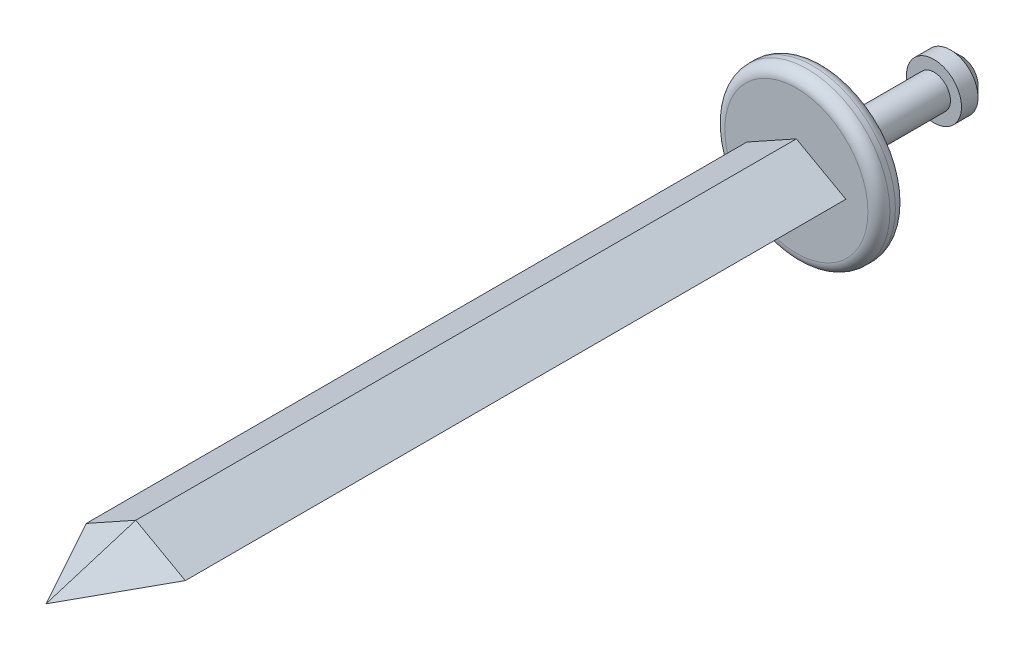
ISO-10303-21;
HEADER;
FILE_DESCRIPTION(('STEP AP214'),'2;1');
FILE_NAME('part.step','',(''),(''),'','','');
FILE_SCHEMA(('AUTOMOTIVE_DESIGN { 1 0 10303 214 1 1 1 1 }'));
ENDSEC;
DATA;
#1=APPLICATION_CONTEXT('core data for automotive mechanical design processes');
#2=APPLICATION_PROTOCOL_DEFINITION('international standard','automotive_design',2000,#1);
#3=PRODUCT_CONTEXT('',#1,'mechanical');
#4=PRODUCT('Part','Part','',(#3));
#5=PRODUCT_RELATED_PRODUCT_CATEGORY('part','',(#4));
#6=PRODUCT_DEFINITION_FORMATION('','',#4);
#7=PRODUCT_DEFINITION_CONTEXT('part definition',#1,'design');
#8=PRODUCT_DEFINITION('design','',#6,#7);
#9=PRODUCT_DEFINITION_SHAPE('','',#8);
#10=(LENGTH_UNIT() NAMED_UNIT(*) SI_UNIT(.MILLI.,.METRE.));
#11=(NAMED_UNIT(*) PLANE_ANGLE_UNIT() SI_UNIT($,.RADIAN.));
#12=(NAMED_UNIT(*) SI_UNIT($,.STERADIAN.) SOLID_ANGLE_UNIT());
#13=UNCERTAINTY_MEASURE_WITH_UNIT(LENGTH_MEASURE(1.E-05),#10,'distance_accuracy_value','');
#14=(GEOMETRIC_REPRESENTATION_CONTEXT(3) GLOBAL_UNCERTAINTY_ASSIGNED_CONTEXT((#13)) GLOBAL_UNIT_ASSIGNED_CONTEXT((#10,
#11,#12)) REPRESENTATION_CONTEXT('',''));
#15=CARTESIAN_POINT('',(0.,0.,0.));
#16=DIRECTION('',(0.,0.,1.));
#17=DIRECTION('',(1.,0.,0.));
#18=AXIS2_PLACEMENT_3D('',#15,#16,#17);
#19=CARTESIAN_POINT('',(0.,0.,5.));
#20=DIRECTION('',(0.,0.,1.));
#21=DIRECTION('',(1.,0.,0.));
#22=AXIS2_PLACEMENT_3D('',#19,#20,#21);
#23=PLANE('',#22);
#24=CARTESIAN_POINT('',(0.,0.,5.));
#25=DIRECTION('',(0.,0.,1.));
#26=DIRECTION('',(1.,0.,0.));
#27=AXIS2_PLACEMENT_3D('',#24,#25,#26);
#28=CIRCLE('',#27,13.);
#29=CARTESIAN_POINT('',(13.,0.,5.));
#30=VERTEX_POINT('',#29);
#31=EDGE_CURVE('E169',#30,#30,#28,.T.);
#32=ORIENTED_EDGE('',*,*,#31,.T.);
#33=EDGE_LOOP('',(#32));
#34=FACE_BOUND('',#33,.T.);
#35=DIRECTION('',(0.874157276121538,-0.485642931178632,0.));
#36=VECTOR('',#35,1.);
#37=CARTESIAN_POINT('',(-9.,0.,5.));
#38=LINE('',#37,#36);
#39=CARTESIAN_POINT('',(-9.,0.,5.));
#40=VERTEX_POINT('',#39);
#41=CARTESIAN_POINT('',(0.,-5.,5.));
#42=VERTEX_POINT('',#41);
#43=EDGE_CURVE('E128',#40,#42,#38,.T.);
#44=ORIENTED_EDGE('',*,*,#43,.F.);
#45=DIRECTION('',(-0.874157276121538,-0.485642931178632,0.));
#46=VECTOR('',#45,1.);
#47=CARTESIAN_POINT('',(-9.,0.,5.));
#48=LINE('',#47,#46);
#49=CARTESIAN_POINT('',(0.,5.,5.));
#50=VERTEX_POINT('',#49);
#51=EDGE_CURVE('E125',#50,#40,#48,.T.);
#52=ORIENTED_EDGE('',*,*,#51,.F.);
#53=DIRECTION('',(-0.874157276121538,0.485642931178632,0.));
#54=VECTOR('',#53,1.);
#55=CARTESIAN_POINT('',(0.,5.,5.));
#56=LINE('',#55,#54);
#57=CARTESIAN_POINT('',(9.,0.,5.));
#58=VERTEX_POINT('',#57);
#59=EDGE_CURVE('E75',#58,#50,#56,.T.);
#60=ORIENTED_EDGE('',*,*,#59,.F.);
#61=DIRECTION('',(0.874157276121538,0.485642931178632,0.));
#62=VECTOR('',#61,1.);
#63=CARTESIAN_POINT('',(0.,-5.,5.));
#64=LINE('',#63,#62);
#65=EDGE_CURVE('E132',#42,#58,#64,.T.);
#66=ORIENTED_EDGE('',*,*,#65,.F.);
#67=EDGE_LOOP('',(#44,#52,#60,#66));
#68=FACE_BOUND('',#67,.T.);
#69=ADVANCED_FACE('F39',(#34,#68),#23,.T.);
#70=CARTESIAN_POINT('',(0.,0.,5.));
#71=DIRECTION('',(0.,0.,-1.));
#72=DIRECTION('',(-1.,0.,0.));
#73=AXIS2_PLACEMENT_3D('',#70,#71,#72);
#74=CYLINDRICAL_SURFACE('',#73,15.);
#75=CARTESIAN_POINT('',(0.,0.,2.));
#76=DIRECTION('',(0.,0.,1.));
#77=DIRECTION('',(1.,0.,0.));
#78=AXIS2_PLACEMENT_3D('',#75,#76,#77);
#79=CIRCLE('',#78,15.);
#80=CARTESIAN_POINT('',(15.,0.,2.));
#81=VERTEX_POINT('',#80);
#82=EDGE_CURVE('E161',#81,#81,#79,.T.);
#83=ORIENTED_EDGE('',*,*,#82,.T.);
#84=EDGE_LOOP('',(#83));
#85=FACE_BOUND('',#84,.T.);
#86=CARTESIAN_POINT('',(0.,0.,3.));
#87=DIRECTION('',(0.,0.,1.));
#88=DIRECTION('',(1.,0.,0.));
#89=AXIS2_PLACEMENT_3D('',#86,#87,#88);
#90=CIRCLE('',#89,15.);
#91=CARTESIAN_POINT('',(15.,0.,3.));
#92=VERTEX_POINT('',#91);
#93=EDGE_CURVE('E157',#92,#92,#90,.F.);
#94=ORIENTED_EDGE('',*,*,#93,.T.);
#95=EDGE_LOOP('',(#94));
#96=FACE_BOUND('',#95,.T.);
#97=ADVANCED_FACE('F191',(#85,#96),#74,.T.);
#98=CARTESIAN_POINT('',(0.,0.,0.));
#99=DIRECTION('',(0.,0.,1.));
#100=DIRECTION('',(1.,0.,0.));
#101=AXIS2_PLACEMENT_3D('',#98,#99,#100);
#102=PLANE('',#101);
#103=CARTESIAN_POINT('',(0.,0.,0.));
#104=DIRECTION('',(0.,0.,1.));
#105=DIRECTION('',(1.,0.,0.));
#106=AXIS2_PLACEMENT_3D('',#103,#104,#105);
#107=CIRCLE('',#106,13.);
#108=CARTESIAN_POINT('',(13.,0.,0.));
#109=VERTEX_POINT('',#108);
#110=EDGE_CURVE('E165',#109,#109,#107,.F.);
#111=ORIENTED_EDGE('',*,*,#110,.T.);
#112=EDGE_LOOP('',(#111));
#113=FACE_BOUND('',#112,.T.);
#114=CARTESIAN_POINT('',(0.,0.,0.));
#115=DIRECTION('',(0.,0.,1.));
#116=DIRECTION('',(1.,0.,0.));
#117=AXIS2_PLACEMENT_3D('',#114,#115,#116);
#118=CIRCLE('',#117,3.);
#119=CARTESIAN_POINT('',(3.,0.,0.));
#120=VERTEX_POINT('',#119);
#121=EDGE_CURVE('E145',#120,#120,#118,.T.);
#122=ORIENTED_EDGE('',*,*,#121,.T.);
#123=EDGE_LOOP('',(#122));
#124=FACE_BOUND('',#123,.T.);
#125=ADVANCED_FACE('F197',(#113,#124),#102,.F.);
#126=CARTESIAN_POINT('',(0.,0.,2.));
#127=DIRECTION('',(0.,0.,1.));
#128=DIRECTION('',(1.,0.,0.));
#129=AXIS2_PLACEMENT_3D('',#126,#127,#128);
#130=TOROIDAL_SURFACE('',#129,13.,2.);
#131=ORIENTED_EDGE('',*,*,#110,.F.);
#132=EDGE_LOOP('',(#131));
#133=FACE_BOUND('',#132,.T.);
#134=ORIENTED_EDGE('',*,*,#82,.F.);
#135=EDGE_LOOP('',(#134));
#136=FACE_BOUND('',#135,.T.);
#137=ADVANCED_FACE('F203',(#133,#136),#130,.T.);
#138=CARTESIAN_POINT('',(0.,0.,3.));
#139=DIRECTION('',(0.,0.,1.));
#140=DIRECTION('',(1.,0.,0.));
#141=AXIS2_PLACEMENT_3D('',#138,#139,#140);
#142=TOROIDAL_SURFACE('',#141,13.,2.);
#143=ORIENTED_EDGE('',*,*,#93,.F.);
#144=EDGE_LOOP('',(#143));
#145=FACE_BOUND('',#144,.T.);
#146=ORIENTED_EDGE('',*,*,#31,.F.);
#147=EDGE_LOOP('',(#146));
#148=FACE_BOUND('',#147,.T.);
#149=ADVANCED_FACE('F207',(#145,#148),#142,.T.);
#150=CARTESIAN_POINT('',(0.,0.,0.));
#151=DIRECTION('',(0.,0.,1.));
#152=DIRECTION('',(1.,0.,0.));
#153=AXIS2_PLACEMENT_3D('',#150,#151,#152);
#154=CYLINDRICAL_SURFACE('',#153,3.00000000000001);
#155=CARTESIAN_POINT('',(0.,0.,-20.));
#156=DIRECTION('',(0.,0.,1.));
#157=DIRECTION('',(1.,0.,0.));
#158=AXIS2_PLACEMENT_3D('',#155,#156,#157);
#159=CIRCLE('',#158,3.00000000000002);
#160=CARTESIAN_POINT('',(3.00000000000002,0.,-20.));
#161=VERTEX_POINT('',#160);
#162=EDGE_CURVE('E153',#161,#161,#159,.T.);
#163=ORIENTED_EDGE('',*,*,#162,.T.);
#164=EDGE_LOOP('',(#163));
#165=FACE_BOUND('',#164,.T.);
#166=ORIENTED_EDGE('',*,*,#121,.F.);
#167=EDGE_LOOP('',(#166));
#168=FACE_BOUND('',#167,.T.);
#169=ADVANCED_FACE('F210',(#165,#168),#154,.T.);
#170=CARTESIAN_POINT('',(-3.00000000000002,0.,-20.));
#171=DIRECTION('',(0.,0.,1.));
#172=DIRECTION('',(1.,0.,0.));
#173=AXIS2_PLACEMENT_3D('',#170,#171,#172);
#174=PLANE('',#173);
#175=CARTESIAN_POINT('',(0.,0.,-20.));
#176=DIRECTION('',(0.,0.,1.));
#177=DIRECTION('',(1.,0.,0.));
#178=AXIS2_PLACEMENT_3D('',#175,#176,#177);
#179=CIRCLE('',#178,5.);
#180=CARTESIAN_POINT('',(5.,0.,-20.));
#181=VERTEX_POINT('',#180);
#182=EDGE_CURVE('E149',#181,#181,#179,.T.);
#183=ORIENTED_EDGE('',*,*,#182,.T.);
#184=EDGE_LOOP('',(#183));
#185=FACE_BOUND('',#184,.T.);
#186=ORIENTED_EDGE('',*,*,#162,.F.);
#187=EDGE_LOOP('',(#186));
#188=FACE_BOUND('',#187,.T.);
#189=ADVANCED_FACE('F187',(#185,#188),#174,.T.);
#190=CARTESIAN_POINT('',(0.,0.,-25.));
#191=DIRECTION('',(0.,0.,-1.));
#192=DIRECTION('',(-1.,0.,0.));
#193=AXIS2_PLACEMENT_3D('',#190,#191,#192);
#194=PLANE('',#193);
#195=CARTESIAN_POINT('',(0.,0.,-25.));
#196=DIRECTION('',(0.,0.,-1.));
#197=DIRECTION('',(-1.,0.,0.));
#198=AXIS2_PLACEMENT_3D('',#195,#196,#197);
#199=CIRCLE('',#198,2.99999999999999);
#200=CARTESIAN_POINT('',(-2.99999999999999,0.,-25.));
#201=VERTEX_POINT('',#200);
#202=EDGE_CURVE('E48',#201,#201,#199,.T.);
#203=ORIENTED_EDGE('',*,*,#202,.T.);
#204=EDGE_LOOP('',(#203));
#205=FACE_BOUND('',#204,.T.);
#206=ADVANCED_FACE('F176',(#205),#194,.T.);
#207=CARTESIAN_POINT('',(0.,0.,-25.));
#208=DIRECTION('',(0.,0.,1.));
#209=DIRECTION('',(1.,0.,0.));
#210=AXIS2_PLACEMENT_3D('',#207,#208,#209);
#211=CONICAL_SURFACE('',#210,2.99999999999999,0.785398163397449);
#212=CARTESIAN_POINT('',(0.,0.,-23.));
#213=DIRECTION('',(0.,0.,-1.));
#214=DIRECTION('',(-1.,0.,0.));
#215=AXIS2_PLACEMENT_3D('',#212,#213,#214);
#216=CIRCLE('',#215,5.);
#217=CARTESIAN_POINT('',(-5.,0.,-23.));
#218=VERTEX_POINT('',#217);
#219=EDGE_CURVE('E11',#218,#218,#216,.F.);
#220=ORIENTED_EDGE('',*,*,#219,.F.);
#221=EDGE_LOOP('',(#220));
#222=FACE_BOUND('',#221,.T.);
#223=ORIENTED_EDGE('',*,*,#202,.F.);
#224=EDGE_LOOP('',(#223));
#225=FACE_BOUND('',#224,.T.);
#226=ADVANCED_FACE('F41',(#222,#225),#211,.T.);
#227=CARTESIAN_POINT('',(0.,0.,-25.));
#228=DIRECTION('',(0.,0.,1.));
#229=DIRECTION('',(1.,0.,0.));
#230=AXIS2_PLACEMENT_3D('',#227,#228,#229);
#231=CYLINDRICAL_SURFACE('',#230,5.);
#232=ORIENTED_EDGE('',*,*,#219,.T.);
#233=EDGE_LOOP('',(#232));
#234=FACE_BOUND('',#233,.T.);
#235=ORIENTED_EDGE('',*,*,#182,.F.);
#236=EDGE_LOOP('',(#235));
#237=FACE_BOUND('',#236,.T.);
#238=ADVANCED_FACE('F179',(#234,#237),#231,.T.);
#239=CARTESIAN_POINT('',(-9.,0.,125.));
#240=DIRECTION('',(0.485642931178632,-0.874157276121538,0.));
#241=DIRECTION('',(0.874157276121538,0.485642931178632,0.));
#242=AXIS2_PLACEMENT_3D('',#239,#240,#241);
#243=PLANE('',#242);
#244=ORIENTED_EDGE('',*,*,#51,.T.);
#245=DIRECTION('',(0.,0.,-1.));
#246=VECTOR('',#245,1.);
#247=CARTESIAN_POINT('',(-9.,0.,125.));
#248=LINE('',#247,#246);
#249=CARTESIAN_POINT('',(-9.,0.,125.));
#250=VERTEX_POINT('',#249);
#251=EDGE_CURVE('E94',#250,#40,#248,.T.);
#252=ORIENTED_EDGE('',*,*,#251,.F.);
#253=DIRECTION('',(-0.874157276121538,-0.485642931178632,0.));
#254=VECTOR('',#253,1.);
#255=CARTESIAN_POINT('',(-9.,0.,125.));
#256=LINE('',#255,#254);
#257=CARTESIAN_POINT('',(0.,5.,125.));
#258=VERTEX_POINT('',#257);
#259=EDGE_CURVE('E89',#258,#250,#256,.T.);
#260=ORIENTED_EDGE('',*,*,#259,.F.);
#261=DIRECTION('',(0.,0.,-1.));
#262=VECTOR('',#261,1.);
#263=CARTESIAN_POINT('',(0.,5.,125.));
#264=LINE('',#263,#262);
#265=EDGE_CURVE('E92',#258,#50,#264,.T.);
#266=ORIENTED_EDGE('',*,*,#265,.T.);
#267=EDGE_LOOP('',(#244,#252,#260,#266));
#268=FACE_BOUND('',#267,.T.);
#269=ADVANCED_FACE('F91',(#268),#243,.F.);
#270=CARTESIAN_POINT('',(-9.,0.,125.));
#271=DIRECTION('',(0.485642931178632,0.874157276121538,0.));
#272=DIRECTION('',(-0.874157276121538,0.485642931178632,0.));
#273=AXIS2_PLACEMENT_3D('',#270,#271,#272);
#274=PLANE('',#273);
#275=ORIENTED_EDGE('',*,*,#43,.T.);
#276=DIRECTION('',(0.,0.,-1.));
#277=VECTOR('',#276,1.);
#278=CARTESIAN_POINT('',(0.,-5.,125.));
#279=LINE('',#278,#277);
#280=CARTESIAN_POINT('',(0.,-5.,125.));
#281=VERTEX_POINT('',#280);
#282=EDGE_CURVE('E139',#281,#42,#279,.T.);
#283=ORIENTED_EDGE('',*,*,#282,.F.);
#284=DIRECTION('',(0.874157276121538,-0.485642931178632,0.));
#285=VECTOR('',#284,1.);
#286=CARTESIAN_POINT('',(-9.,0.,125.));
#287=LINE('',#286,#285);
#288=EDGE_CURVE('E80',#250,#281,#287,.T.);
#289=ORIENTED_EDGE('',*,*,#288,.F.);
#290=ORIENTED_EDGE('',*,*,#251,.T.);
#291=EDGE_LOOP('',(#275,#283,#289,#290));
#292=FACE_BOUND('',#291,.T.);
#293=ADVANCED_FACE('F230',(#292),#274,.F.);
#294=CARTESIAN_POINT('',(0.,-5.,125.));
#295=DIRECTION('',(-0.485642931178632,0.874157276121538,0.));
#296=DIRECTION('',(-0.874157276121538,-0.485642931178632,0.));
#297=AXIS2_PLACEMENT_3D('',#294,#295,#296);
#298=PLANE('',#297);
#299=ORIENTED_EDGE('',*,*,#65,.T.);
#300=DIRECTION('',(0.,0.,-1.));
#301=VECTOR('',#300,1.);
#302=CARTESIAN_POINT('',(9.,0.,125.));
#303=LINE('',#302,#301);
#304=CARTESIAN_POINT('',(9.,0.,125.));
#305=VERTEX_POINT('',#304);
#306=EDGE_CURVE('E55',#305,#58,#303,.T.);
#307=ORIENTED_EDGE('',*,*,#306,.F.);
#308=DIRECTION('',(0.874157276121538,0.485642931178632,0.));
#309=VECTOR('',#308,1.);
#310=CARTESIAN_POINT('',(0.,-5.,125.));
#311=LINE('',#310,#309);
#312=EDGE_CURVE('E119',#281,#305,#311,.T.);
#313=ORIENTED_EDGE('',*,*,#312,.F.);
#314=ORIENTED_EDGE('',*,*,#282,.T.);
#315=EDGE_LOOP('',(#299,#307,#313,#314));
#316=FACE_BOUND('',#315,.T.);
#317=ADVANCED_FACE('F233',(#316),#298,.F.);
#318=CARTESIAN_POINT('',(0.,5.,125.));
#319=DIRECTION('',(-0.485642931178632,-0.874157276121538,0.));
#320=DIRECTION('',(0.874157276121538,-0.485642931178632,0.));
#321=AXIS2_PLACEMENT_3D('',#318,#319,#320);
#322=PLANE('',#321);
#323=ORIENTED_EDGE('',*,*,#59,.T.);
#324=ORIENTED_EDGE('',*,*,#265,.F.);
#325=DIRECTION('',(-0.874157276121538,0.485642931178632,0.));
#326=VECTOR('',#325,1.);
#327=CARTESIAN_POINT('',(0.,5.,125.));
#328=LINE('',#327,#326);
#329=EDGE_CURVE('E103',#305,#258,#328,.T.);
#330=ORIENTED_EDGE('',*,*,#329,.F.);
#331=ORIENTED_EDGE('',*,*,#306,.T.);
#332=EDGE_LOOP('',(#323,#324,#330,#331));
#333=FACE_BOUND('',#332,.T.);
#334=ADVANCED_FACE('F101',(#333),#322,.F.);
#335=CARTESIAN_POINT('',(-9.,0.,125.));
#336=DIRECTION('',(-0.469095049580165,-0.844371089244297,0.258819045102521));
#337=DIRECTION('',(0.874157276121538,-0.485642931178632,0.));
#338=AXIS2_PLACEMENT_3D('',#335,#336,#337);
#339=PLANE('',#338);
#340=ORIENTED_EDGE('',*,*,#288,.T.);
#341=DIRECTION('',(0.,-0.293064285105159,-0.956092738595897));
#342=VECTOR('',#341,1.);
#343=CARTESIAN_POINT('',(0.,-5.,125.));
#344=LINE('',#343,#342);
#345=CARTESIAN_POINT('',(0.,0.,141.311996841458));
#346=VERTEX_POINT('',#345);
#347=EDGE_CURVE('E129',#346,#281,#344,.T.);
#348=ORIENTED_EDGE('',*,*,#347,.F.);
#349=DIRECTION('',(-0.483088766408261,0.,-0.875571381310596));
#350=VECTOR('',#349,1.);
#351=CARTESIAN_POINT('',(-9.,0.,125.));
#352=LINE('',#351,#350);
#353=EDGE_CURVE('E110',#346,#250,#352,.T.);
#354=ORIENTED_EDGE('',*,*,#353,.T.);
#355=EDGE_LOOP('',(#340,#348,#354));
#356=FACE_BOUND('',#355,.T.);
#357=ADVANCED_FACE('F238',(#356),#339,.T.);
#358=CARTESIAN_POINT('',(0.,-5.,125.));
#359=DIRECTION('',(0.469095049580165,-0.844371089244297,0.258819045102521));
#360=DIRECTION('',(0.874157276121538,0.485642931178632,0.));
#361=AXIS2_PLACEMENT_3D('',#358,#359,#360);
#362=PLANE('',#361);
#363=ORIENTED_EDGE('',*,*,#312,.T.);
#364=DIRECTION('',(0.483088766408261,0.,-0.875571381310596));
#365=VECTOR('',#364,1.);
#366=CARTESIAN_POINT('',(9.,0.,125.));
#367=LINE('',#366,#365);
#368=EDGE_CURVE('E114',#346,#305,#367,.T.);
#369=ORIENTED_EDGE('',*,*,#368,.F.);
#370=ORIENTED_EDGE('',*,*,#347,.T.);
#371=EDGE_LOOP('',(#363,#369,#370));
#372=FACE_BOUND('',#371,.T.);
#373=ADVANCED_FACE('F239',(#372),#362,.T.);
#374=CARTESIAN_POINT('',(9.,0.,125.));
#375=DIRECTION('',(0.469095049580165,0.844371089244297,0.258819045102521));
#376=DIRECTION('',(-0.874157276121538,0.485642931178632,0.));
#377=AXIS2_PLACEMENT_3D('',#374,#375,#376);
#378=PLANE('',#377);
#379=ORIENTED_EDGE('',*,*,#329,.T.);
#380=DIRECTION('',(0.,0.293064285105159,-0.956092738595897));
#381=VECTOR('',#380,1.);
#382=CARTESIAN_POINT('',(0.,5.,125.));
#383=LINE('',#382,#381);
#384=EDGE_CURVE('E108',#346,#258,#383,.T.);
#385=ORIENTED_EDGE('',*,*,#384,.F.);
#386=ORIENTED_EDGE('',*,*,#368,.T.);
#387=EDGE_LOOP('',(#379,#385,#386));
#388=FACE_BOUND('',#387,.T.);
#389=ADVANCED_FACE('F116',(#388),#378,.T.);
#390=CARTESIAN_POINT('',(0.,5.,125.));
#391=DIRECTION('',(-0.469095049580165,0.844371089244297,0.258819045102521));
#392=DIRECTION('',(-0.874157276121538,-0.485642931178632,0.));
#393=AXIS2_PLACEMENT_3D('',#390,#391,#392);
#394=PLANE('',#393);
#395=ORIENTED_EDGE('',*,*,#259,.T.);
#396=ORIENTED_EDGE('',*,*,#353,.F.);
#397=ORIENTED_EDGE('',*,*,#384,.T.);
#398=EDGE_LOOP('',(#395,#396,#397));
#399=FACE_BOUND('',#398,.T.);
#400=ADVANCED_FACE('F109',(#399),#394,.T.);
#401=CLOSED_SHELL('',(#69,#97,#125,#137,#149,#169,#189,#206,#226,#238,#269,#293,#317,#334,#357,
#373,#389,#400));
#402=MANIFOLD_SOLID_BREP('B2',#401);
#403=ADVANCED_BREP_SHAPE_REPRESENTATION('',(#18,#402),#14);
#404=SHAPE_DEFINITION_REPRESENTATION(#9,#403);
ENDSEC;
END-ISO-10303-21;
